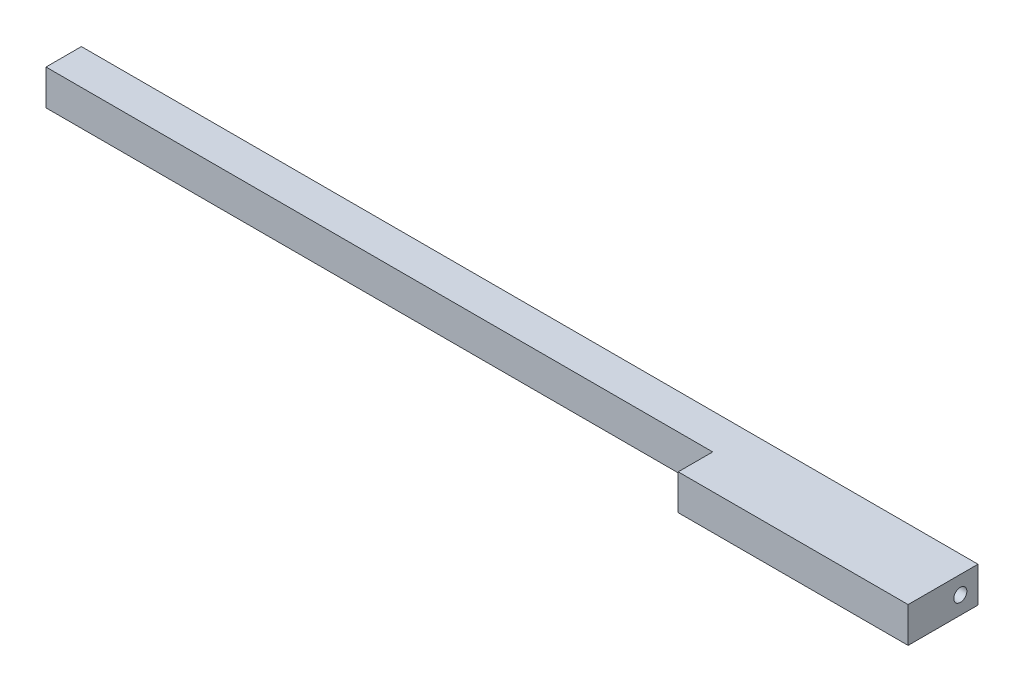
ISO-10303-21;
HEADER;
FILE_DESCRIPTION(('STEP AP214'),'2;1');
FILE_NAME('part.step','',(''),(''),'','','');
FILE_SCHEMA(('AUTOMOTIVE_DESIGN { 1 0 10303 214 1 1 1 1 }'));
ENDSEC;
DATA;
#1=APPLICATION_CONTEXT('core data for automotive mechanical design processes');
#2=APPLICATION_PROTOCOL_DEFINITION('international standard','automotive_design',2000,#1);
#3=PRODUCT_CONTEXT('',#1,'mechanical');
#4=PRODUCT('Part','Part','',(#3));
#5=PRODUCT_RELATED_PRODUCT_CATEGORY('part','',(#4));
#6=PRODUCT_DEFINITION_FORMATION('','',#4);
#7=PRODUCT_DEFINITION_CONTEXT('part definition',#1,'design');
#8=PRODUCT_DEFINITION('design','',#6,#7);
#9=PRODUCT_DEFINITION_SHAPE('','',#8);
#10=(LENGTH_UNIT() NAMED_UNIT(*) SI_UNIT(.MILLI.,.METRE.));
#11=(NAMED_UNIT(*) PLANE_ANGLE_UNIT() SI_UNIT($,.RADIAN.));
#12=(NAMED_UNIT(*) SI_UNIT($,.STERADIAN.) SOLID_ANGLE_UNIT());
#13=UNCERTAINTY_MEASURE_WITH_UNIT(LENGTH_MEASURE(1.E-05),#10,'distance_accuracy_value','');
#14=(GEOMETRIC_REPRESENTATION_CONTEXT(3) GLOBAL_UNCERTAINTY_ASSIGNED_CONTEXT((#13)) GLOBAL_UNIT_ASSIGNED_CONTEXT((#10,
#11,#12)) REPRESENTATION_CONTEXT('',''));
#15=CARTESIAN_POINT('',(0.,0.,0.));
#16=DIRECTION('',(0.,0.,1.));
#17=DIRECTION('',(1.,0.,0.));
#18=AXIS2_PLACEMENT_3D('',#15,#16,#17);
#19=CARTESIAN_POINT('',(20.828,91.821,34.671));
#20=DIRECTION('',(0.,0.,1.));
#21=DIRECTION('',(1.,0.,0.));
#22=AXIS2_PLACEMENT_3D('',#19,#20,#21);
#23=PLANE('',#22);
#24=DIRECTION('',(-1.,0.,0.));
#25=VECTOR('',#24,1.);
#26=CARTESIAN_POINT('',(20.828,91.821,34.671));
#27=LINE('',#26,#25);
#28=CARTESIAN_POINT('',(20.828,91.821,34.671));
#29=VERTEX_POINT('',#28);
#30=CARTESIAN_POINT('',(-474.472,91.821,34.6710000000001));
#31=VERTEX_POINT('',#30);
#32=EDGE_CURVE('E55',#29,#31,#27,.T.);
#33=ORIENTED_EDGE('',*,*,#32,.T.);
#34=DIRECTION('',(0.,1.,0.));
#35=VECTOR('',#34,1.);
#36=CARTESIAN_POINT('',(-474.472,91.821,34.6710000000001));
#37=LINE('',#36,#35);
#38=CARTESIAN_POINT('',(-474.472,111.379,34.6710000000001));
#39=VERTEX_POINT('',#38);
#40=EDGE_CURVE('E121',#31,#39,#37,.T.);
#41=ORIENTED_EDGE('',*,*,#40,.T.);
#42=DIRECTION('',(-1.,0.,0.));
#43=VECTOR('',#42,1.);
#44=CARTESIAN_POINT('',(20.828,111.379,34.671));
#45=LINE('',#44,#43);
#46=CARTESIAN_POINT('',(20.828,111.379,34.671));
#47=VERTEX_POINT('',#46);
#48=EDGE_CURVE('E11',#47,#39,#45,.T.);
#49=ORIENTED_EDGE('',*,*,#48,.F.);
#50=DIRECTION('',(0.,1.,0.));
#51=VECTOR('',#50,1.);
#52=CARTESIAN_POINT('',(20.828,91.821,34.671));
#53=LINE('',#52,#51);
#54=EDGE_CURVE('E90',#29,#47,#53,.T.);
#55=ORIENTED_EDGE('',*,*,#54,.F.);
#56=EDGE_LOOP('',(#33,#41,#49,#55));
#57=FACE_BOUND('',#56,.T.);
#58=ADVANCED_FACE('F33',(#57),#23,.F.);
#59=CARTESIAN_POINT('',(20.828,111.379,34.671));
#60=DIRECTION('',(0.,-1.,0.));
#61=DIRECTION('',(0.,0.,-1.));
#62=AXIS2_PLACEMENT_3D('',#59,#60,#61);
#63=PLANE('',#62);
#64=ORIENTED_EDGE('',*,*,#48,.T.);
#65=DIRECTION('',(0.,0.,1.));
#66=VECTOR('',#65,1.);
#67=CARTESIAN_POINT('',(-474.472,111.379,34.6710000000001));
#68=LINE('',#67,#66);
#69=CARTESIAN_POINT('',(-474.472,111.379,54.2290000000001));
#70=VERTEX_POINT('',#69);
#71=EDGE_CURVE('E126',#39,#70,#68,.T.);
#72=ORIENTED_EDGE('',*,*,#71,.T.);
#73=DIRECTION('',(-1.,0.,0.));
#74=VECTOR('',#73,1.);
#75=CARTESIAN_POINT('',(20.828,111.379,54.229));
#76=LINE('',#75,#74);
#77=CARTESIAN_POINT('',(-106.172,111.379,54.229));
#78=VERTEX_POINT('',#77);
#79=EDGE_CURVE('E40',#78,#70,#76,.T.);
#80=ORIENTED_EDGE('',*,*,#79,.F.);
#81=DIRECTION('',(0.,0.,-1.));
#82=VECTOR('',#81,1.);
#83=CARTESIAN_POINT('',(-106.172,111.379,73.279));
#84=LINE('',#83,#82);
#85=CARTESIAN_POINT('',(-106.172,111.379,73.279));
#86=VERTEX_POINT('',#85);
#87=EDGE_CURVE('E99',#86,#78,#84,.T.);
#88=ORIENTED_EDGE('',*,*,#87,.F.);
#89=DIRECTION('',(-1.,0.,0.));
#90=VECTOR('',#89,1.);
#91=CARTESIAN_POINT('',(-106.172,111.379,73.279));
#92=LINE('',#91,#90);
#93=CARTESIAN_POINT('',(20.828,111.379,73.279));
#94=VERTEX_POINT('',#93);
#95=EDGE_CURVE('E96',#94,#86,#92,.T.);
#96=ORIENTED_EDGE('',*,*,#95,.F.);
#97=DIRECTION('',(0.,0.,1.));
#98=VECTOR('',#97,1.);
#99=CARTESIAN_POINT('',(20.828,111.379,34.671));
#100=LINE('',#99,#98);
#101=EDGE_CURVE('E84',#47,#94,#100,.T.);
#102=ORIENTED_EDGE('',*,*,#101,.F.);
#103=EDGE_LOOP('',(#64,#72,#80,#88,#96,#102));
#104=FACE_BOUND('',#103,.T.);
#105=ADVANCED_FACE('F97',(#104),#63,.F.);
#106=CARTESIAN_POINT('',(20.828,91.821,54.229));
#107=DIRECTION('',(0.,0.,1.));
#108=DIRECTION('',(1.,0.,0.));
#109=AXIS2_PLACEMENT_3D('',#106,#107,#108);
#110=PLANE('',#109);
#111=DIRECTION('',(0.,-1.,0.));
#112=VECTOR('',#111,1.);
#113=CARTESIAN_POINT('',(-106.172,111.379,54.229));
#114=LINE('',#113,#112);
#115=CARTESIAN_POINT('',(-106.172,91.821,54.229));
#116=VERTEX_POINT('',#115);
#117=EDGE_CURVE('E47',#78,#116,#114,.T.);
#118=ORIENTED_EDGE('',*,*,#117,.F.);
#119=ORIENTED_EDGE('',*,*,#79,.T.);
#120=DIRECTION('',(0.,1.,0.));
#121=VECTOR('',#120,1.);
#122=CARTESIAN_POINT('',(-474.472,91.821,54.2290000000001));
#123=LINE('',#122,#121);
#124=CARTESIAN_POINT('',(-474.472,91.821,54.2290000000001));
#125=VERTEX_POINT('',#124);
#126=EDGE_CURVE('E129',#125,#70,#123,.T.);
#127=ORIENTED_EDGE('',*,*,#126,.F.);
#128=DIRECTION('',(-1.,0.,0.));
#129=VECTOR('',#128,1.);
#130=CARTESIAN_POINT('',(20.828,91.821,54.229));
#131=LINE('',#130,#129);
#132=EDGE_CURVE('E138',#116,#125,#131,.T.);
#133=ORIENTED_EDGE('',*,*,#132,.F.);
#134=EDGE_LOOP('',(#118,#119,#127,#133));
#135=FACE_BOUND('',#134,.T.);
#136=ADVANCED_FACE('F140',(#135),#110,.T.);
#137=CARTESIAN_POINT('',(20.828,91.821,34.671));
#138=DIRECTION('',(0.,-1.,0.));
#139=DIRECTION('',(0.,0.,-1.));
#140=AXIS2_PLACEMENT_3D('',#137,#138,#139);
#141=PLANE('',#140);
#142=DIRECTION('',(0.,0.,1.));
#143=VECTOR('',#142,1.);
#144=CARTESIAN_POINT('',(20.828,91.821,34.671));
#145=LINE('',#144,#143);
#146=CARTESIAN_POINT('',(20.828,91.821,73.279));
#147=VERTEX_POINT('',#146);
#148=EDGE_CURVE('E93',#29,#147,#145,.T.);
#149=ORIENTED_EDGE('',*,*,#148,.T.);
#150=DIRECTION('',(1.,0.,0.));
#151=VECTOR('',#150,1.);
#152=CARTESIAN_POINT('',(-106.172,91.821,73.279));
#153=LINE('',#152,#151);
#154=CARTESIAN_POINT('',(-106.172,91.821,73.279));
#155=VERTEX_POINT('',#154);
#156=EDGE_CURVE('E107',#155,#147,#153,.T.);
#157=ORIENTED_EDGE('',*,*,#156,.F.);
#158=DIRECTION('',(0.,0.,-1.));
#159=VECTOR('',#158,1.);
#160=CARTESIAN_POINT('',(-106.172,91.821,73.279));
#161=LINE('',#160,#159);
#162=EDGE_CURVE('E112',#155,#116,#161,.T.);
#163=ORIENTED_EDGE('',*,*,#162,.T.);
#164=ORIENTED_EDGE('',*,*,#132,.T.);
#165=DIRECTION('',(0.,0.,1.));
#166=VECTOR('',#165,1.);
#167=CARTESIAN_POINT('',(-474.472,91.821,34.6710000000001));
#168=LINE('',#167,#166);
#169=EDGE_CURVE('E132',#31,#125,#168,.T.);
#170=ORIENTED_EDGE('',*,*,#169,.F.);
#171=ORIENTED_EDGE('',*,*,#32,.F.);
#172=EDGE_LOOP('',(#149,#157,#163,#164,#170,#171));
#173=FACE_BOUND('',#172,.T.);
#174=ADVANCED_FACE('F146',(#173),#141,.T.);
#175=CARTESIAN_POINT('',(20.828,0.,0.));
#176=DIRECTION('',(1.,0.,0.));
#177=DIRECTION('',(0.,0.,-1.));
#178=AXIS2_PLACEMENT_3D('',#175,#176,#177);
#179=PLANE('',#178);
#180=CARTESIAN_POINT('',(20.828,101.6,44.45));
#181=DIRECTION('',(1.,0.,0.));
#182=DIRECTION('',(0.,0.,-1.));
#183=AXIS2_PLACEMENT_3D('',#180,#181,#182);
#184=CIRCLE('',#183,3.61950000000001);
#185=CARTESIAN_POINT('',(20.828,101.6,40.8305));
#186=VERTEX_POINT('',#185);
#187=EDGE_CURVE('E117',#186,#186,#184,.T.);
#188=ORIENTED_EDGE('',*,*,#187,.F.);
#189=EDGE_LOOP('',(#188));
#190=FACE_BOUND('',#189,.T.);
#191=ORIENTED_EDGE('',*,*,#54,.T.);
#192=ORIENTED_EDGE('',*,*,#101,.T.);
#193=DIRECTION('',(0.,1.,0.));
#194=VECTOR('',#193,1.);
#195=CARTESIAN_POINT('',(20.828,111.379,73.279));
#196=LINE('',#195,#194);
#197=EDGE_CURVE('E89',#147,#94,#196,.T.);
#198=ORIENTED_EDGE('',*,*,#197,.F.);
#199=ORIENTED_EDGE('',*,*,#148,.F.);
#200=EDGE_LOOP('',(#191,#192,#198,#199));
#201=FACE_BOUND('',#200,.T.);
#202=ADVANCED_FACE('F86',(#190,#201),#179,.T.);
#203=CARTESIAN_POINT('',(-474.472,0.,0.));
#204=DIRECTION('',(1.,0.,0.));
#205=DIRECTION('',(0.,0.,-1.));
#206=AXIS2_PLACEMENT_3D('',#203,#204,#205);
#207=PLANE('',#206);
#208=ORIENTED_EDGE('',*,*,#40,.F.);
#209=ORIENTED_EDGE('',*,*,#169,.T.);
#210=ORIENTED_EDGE('',*,*,#126,.T.);
#211=ORIENTED_EDGE('',*,*,#71,.F.);
#212=EDGE_LOOP('',(#208,#209,#210,#211));
#213=FACE_BOUND('',#212,.T.);
#214=ADVANCED_FACE('F144',(#213),#207,.F.);
#215=CARTESIAN_POINT('',(-17.272,101.6,44.45));
#216=DIRECTION('',(1.,0.,0.));
#217=DIRECTION('',(0.,0.,-1.));
#218=AXIS2_PLACEMENT_3D('',#215,#216,#217);
#219=CYLINDRICAL_SURFACE('',#218,3.61950000000001);
#220=CARTESIAN_POINT('',(-17.272,101.6,44.45));
#221=DIRECTION('',(1.,0.,0.));
#222=DIRECTION('',(0.,0.,-1.));
#223=AXIS2_PLACEMENT_3D('',#220,#221,#222);
#224=CIRCLE('',#223,3.61950000000001);
#225=CARTESIAN_POINT('',(-17.272,101.6,40.8305));
#226=VERTEX_POINT('',#225);
#227=EDGE_CURVE('E118',#226,#226,#224,.T.);
#228=CARTESIAN_POINT('',(-17.272,101.6,40.8305));
#229=CARTESIAN_POINT('',(-16.875125,101.6,40.8305));
#230=CARTESIAN_POINT('',(-16.47825,101.6,40.8305));
#231=CARTESIAN_POINT('',(-15.6845,101.6,40.8305));
#232=CARTESIAN_POINT('',(-15.287625,101.6,40.8305));
#233=CARTESIAN_POINT('',(-14.493875,101.6,40.8305));
#234=CARTESIAN_POINT('',(-14.097,101.6,40.8305));
#235=CARTESIAN_POINT('',(-13.30325,101.6,40.8305));
#236=CARTESIAN_POINT('',(-12.906375,101.6,40.8305));
#237=CARTESIAN_POINT('',(-12.112625,101.6,40.8305));
#238=CARTESIAN_POINT('',(-11.71575,101.6,40.8305));
#239=CARTESIAN_POINT('',(-10.922,101.6,40.8305));
#240=CARTESIAN_POINT('',(-10.525125,101.6,40.8305));
#241=CARTESIAN_POINT('',(-9.731375,101.6,40.8305));
#242=CARTESIAN_POINT('',(-9.3345,101.6,40.8305));
#243=CARTESIAN_POINT('',(-8.54075,101.6,40.8305));
#244=CARTESIAN_POINT('',(-8.143875,101.6,40.8305));
#245=CARTESIAN_POINT('',(-7.350125,101.6,40.8305));
#246=CARTESIAN_POINT('',(-6.95325,101.6,40.8305));
#247=CARTESIAN_POINT('',(-6.1595,101.6,40.8305));
#248=CARTESIAN_POINT('',(-5.762625,101.6,40.8305));
#249=CARTESIAN_POINT('',(-4.968875,101.6,40.8305));
#250=CARTESIAN_POINT('',(-4.572,101.6,40.8305));
#251=CARTESIAN_POINT('',(-3.77825,101.6,40.8305));
#252=CARTESIAN_POINT('',(-3.381375,101.6,40.8305));
#253=CARTESIAN_POINT('',(-2.587625,101.6,40.8305));
#254=CARTESIAN_POINT('',(-2.19075,101.6,40.8305));
#255=CARTESIAN_POINT('',(-1.397,101.6,40.8305));
#256=CARTESIAN_POINT('',(-1.000125,101.6,40.8305));
#257=CARTESIAN_POINT('',(-0.206374999999996,101.6,40.8305));
#258=CARTESIAN_POINT('',(0.190500000000004,101.6,40.8305));
#259=CARTESIAN_POINT('',(0.984250000000005,101.6,40.8305));
#260=CARTESIAN_POINT('',(1.38112500000001,101.6,40.8305));
#261=CARTESIAN_POINT('',(2.17487500000001,101.6,40.8305));
#262=CARTESIAN_POINT('',(2.57175000000001,101.6,40.8305));
#263=CARTESIAN_POINT('',(3.36550000000001,101.6,40.8305));
#264=CARTESIAN_POINT('',(3.76237500000001,101.6,40.8305));
#265=CARTESIAN_POINT('',(4.55612500000001,101.6,40.8305));
#266=CARTESIAN_POINT('',(4.95300000000001,101.6,40.8305));
#267=CARTESIAN_POINT('',(5.74675000000001,101.6,40.8305));
#268=CARTESIAN_POINT('',(6.14362500000001,101.6,40.8305));
#269=CARTESIAN_POINT('',(6.93737500000001,101.6,40.8305));
#270=CARTESIAN_POINT('',(7.33425000000001,101.6,40.8305));
#271=CARTESIAN_POINT('',(8.12800000000001,101.6,40.8305));
#272=CARTESIAN_POINT('',(8.52487500000001,101.6,40.8305));
#273=CARTESIAN_POINT('',(9.31862500000001,101.6,40.8305));
#274=CARTESIAN_POINT('',(9.71550000000001,101.6,40.8305));
#275=CARTESIAN_POINT('',(10.50925,101.6,40.8305));
#276=CARTESIAN_POINT('',(10.906125,101.6,40.8305));
#277=CARTESIAN_POINT('',(11.699875,101.6,40.8305));
#278=CARTESIAN_POINT('',(12.09675,101.6,40.8305));
#279=CARTESIAN_POINT('',(12.8905,101.6,40.8305));
#280=CARTESIAN_POINT('',(13.287375,101.6,40.8305));
#281=CARTESIAN_POINT('',(14.081125,101.6,40.8305));
#282=CARTESIAN_POINT('',(14.478,101.6,40.8305));
#283=CARTESIAN_POINT('',(15.27175,101.6,40.8305));
#284=CARTESIAN_POINT('',(15.668625,101.6,40.8305));
#285=CARTESIAN_POINT('',(16.462375,101.6,40.8305));
#286=CARTESIAN_POINT('',(16.85925,101.6,40.8305));
#287=CARTESIAN_POINT('',(17.653,101.6,40.8305));
#288=CARTESIAN_POINT('',(18.049875,101.6,40.8305));
#289=CARTESIAN_POINT('',(18.843625,101.6,40.8305));
#290=CARTESIAN_POINT('',(19.2405,101.6,40.8305));
#291=CARTESIAN_POINT('',(20.03425,101.6,40.8305));
#292=CARTESIAN_POINT('',(20.431125,101.6,40.8305));
#293=CARTESIAN_POINT('',(20.828,101.6,40.8305));
#294=B_SPLINE_CURVE_WITH_KNOTS('',3,(#228,#229,#230,#231,#232,#233,#234,#235,#236,#237,#238,
#239,#240,#241,#242,#243,#244,#245,#246,#247,#248,#249,#250,#251,#252,#253,#254,#255,#256,#257,
#258,#259,#260,#261,#262,#263,#264,#265,#266,#267,#268,#269,#270,#271,#272,#273,#274,#275,#276,
#277,#278,#279,#280,#281,#282,#283,#284,#285,#286,#287,#288,#289,#290,#291,#292,#293),
.UNSPECIFIED.,.F.,.F.,(4,2,2,2,2,2,2,2,2,2,2,2,2,2,2,2,2,2,2,2,2,2,2,2,2,2,2,2,2,2,2,2,4),(0.,
1.190625,2.38125,3.571875,4.7625,5.953125,7.14375,8.334375,9.525,10.715625,11.90625,13.096875,
14.2875,15.478125,16.66875,17.859375,19.05,20.240625,21.43125,22.621875,23.8125,25.003125,
26.19375,27.384375,28.575,29.765625,30.95625,32.146875,33.3375,34.528125,35.71875,36.909375,
38.1),.UNSPECIFIED.);
#295=EDGE_CURVE('BSEAM159',#226,#186,#294,.T.);
#296=ORIENTED_EDGE('',*,*,#227,.F.);
#297=ORIENTED_EDGE('',*,*,#187,.T.);
#298=ORIENTED_EDGE('',*,*,#295,.T.);
#299=ORIENTED_EDGE('',*,*,#295,.F.);
#300=EDGE_LOOP('',(#296,#298,#297,#299));
#301=FACE_BOUND('',#300,.T.);
#302=ADVANCED_FACE('F159',(#301),#219,.F.);
#303=CARTESIAN_POINT('',(-17.272,101.6,44.45));
#304=DIRECTION('',(1.,0.,0.));
#305=DIRECTION('',(0.,0.,-1.));
#306=AXIS2_PLACEMENT_3D('',#303,#304,#305);
#307=PLANE('',#306);
#308=ORIENTED_EDGE('',*,*,#227,.T.);
#309=EDGE_LOOP('',(#308));
#310=FACE_BOUND('',#309,.T.);
#311=ADVANCED_FACE('F151',(#310),#307,.T.);
#312=CARTESIAN_POINT('',(-106.172,111.379,73.279));
#313=DIRECTION('',(1.,0.,0.));
#314=DIRECTION('',(0.,0.,-1.));
#315=AXIS2_PLACEMENT_3D('',#312,#313,#314);
#316=PLANE('',#315);
#317=ORIENTED_EDGE('',*,*,#117,.T.);
#318=ORIENTED_EDGE('',*,*,#162,.F.);
#319=DIRECTION('',(0.,-1.,0.));
#320=VECTOR('',#319,1.);
#321=CARTESIAN_POINT('',(-106.172,111.379,73.279));
#322=LINE('',#321,#320);
#323=EDGE_CURVE('E102',#86,#155,#322,.T.);
#324=ORIENTED_EDGE('',*,*,#323,.F.);
#325=ORIENTED_EDGE('',*,*,#87,.T.);
#326=EDGE_LOOP('',(#317,#318,#324,#325));
#327=FACE_BOUND('',#326,.T.);
#328=ADVANCED_FACE('F149',(#327),#316,.F.);
#329=CARTESIAN_POINT('',(0.,0.,73.279));
#330=DIRECTION('',(0.,0.,1.));
#331=DIRECTION('',(1.,0.,0.));
#332=AXIS2_PLACEMENT_3D('',#329,#330,#331);
#333=PLANE('',#332);
#334=ORIENTED_EDGE('',*,*,#197,.T.);
#335=ORIENTED_EDGE('',*,*,#95,.T.);
#336=ORIENTED_EDGE('',*,*,#323,.T.);
#337=ORIENTED_EDGE('',*,*,#156,.T.);
#338=EDGE_LOOP('',(#334,#335,#336,#337));
#339=FACE_BOUND('',#338,.T.);
#340=ADVANCED_FACE('F105',(#339),#333,.T.);
#341=CLOSED_SHELL('',(#58,#105,#136,#174,#202,#214,#302,#311,#328,#340));
#342=MANIFOLD_SOLID_BREP('B2',#341);
#343=ADVANCED_BREP_SHAPE_REPRESENTATION('',(#18,#342),#14);
#344=SHAPE_DEFINITION_REPRESENTATION(#9,#343);
ENDSEC;
END-ISO-10303-21;
